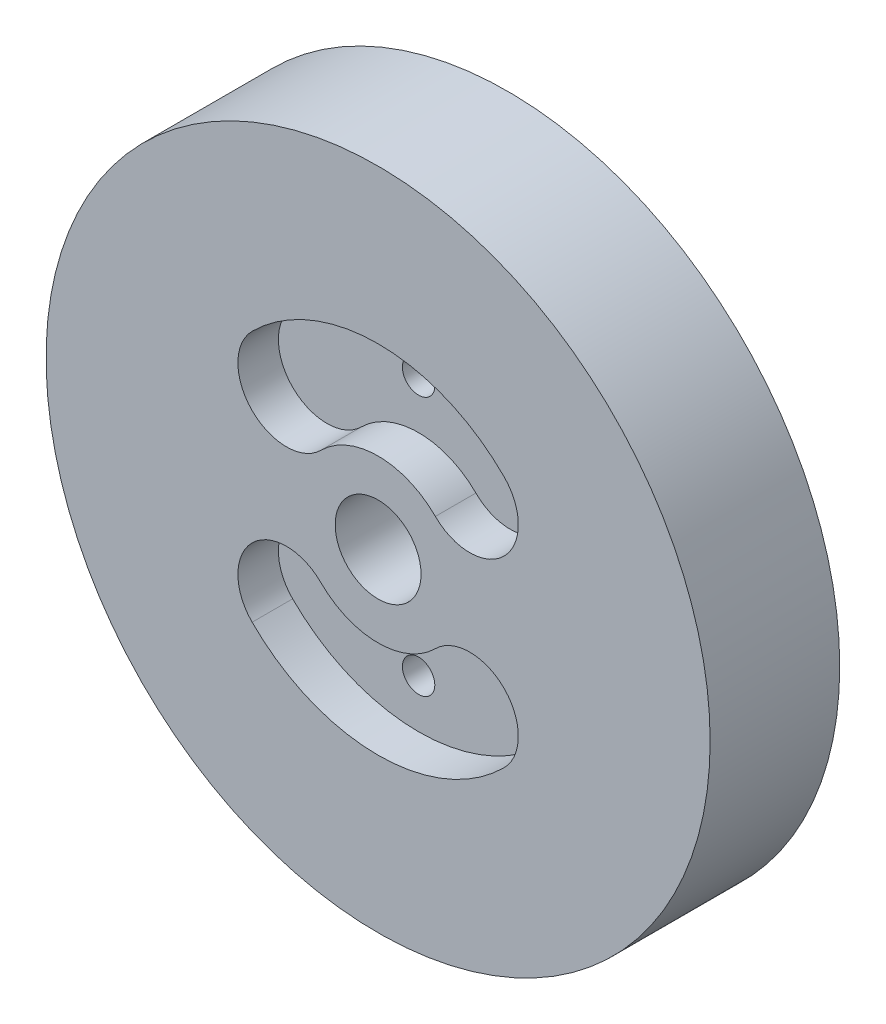
ISO-10303-21;
HEADER;
FILE_DESCRIPTION(('STEP AP214'),'2;1');
FILE_NAME('part.step','',(''),(''),'','','');
FILE_SCHEMA(('AUTOMOTIVE_DESIGN { 1 0 10303 214 1 1 1 1 }'));
ENDSEC;
DATA;
#1=APPLICATION_CONTEXT('core data for automotive mechanical design processes');
#2=APPLICATION_PROTOCOL_DEFINITION('international standard','automotive_design',2000,#1);
#3=PRODUCT_CONTEXT('',#1,'mechanical');
#4=PRODUCT('Part','Part','',(#3));
#5=PRODUCT_RELATED_PRODUCT_CATEGORY('part','',(#4));
#6=PRODUCT_DEFINITION_FORMATION('','',#4);
#7=PRODUCT_DEFINITION_CONTEXT('part definition',#1,'design');
#8=PRODUCT_DEFINITION('design','',#6,#7);
#9=PRODUCT_DEFINITION_SHAPE('','',#8);
#10=(LENGTH_UNIT() NAMED_UNIT(*) SI_UNIT(.MILLI.,.METRE.));
#11=(NAMED_UNIT(*) PLANE_ANGLE_UNIT() SI_UNIT($,.RADIAN.));
#12=(NAMED_UNIT(*) SI_UNIT($,.STERADIAN.) SOLID_ANGLE_UNIT());
#13=UNCERTAINTY_MEASURE_WITH_UNIT(LENGTH_MEASURE(1.E-05),#10,'distance_accuracy_value','');
#14=(GEOMETRIC_REPRESENTATION_CONTEXT(3) GLOBAL_UNCERTAINTY_ASSIGNED_CONTEXT((#13)) GLOBAL_UNIT_ASSIGNED_CONTEXT((#10,
#11,#12)) REPRESENTATION_CONTEXT('',''));
#15=CARTESIAN_POINT('',(0.,0.,0.));
#16=DIRECTION('',(0.,0.,1.));
#17=DIRECTION('',(1.,0.,0.));
#18=AXIS2_PLACEMENT_3D('',#15,#16,#17);
#19=CARTESIAN_POINT('',(0.,0.,0.));
#20=DIRECTION('',(0.,0.,1.));
#21=DIRECTION('',(1.,0.,0.));
#22=AXIS2_PLACEMENT_3D('',#19,#20,#21);
#23=PLANE('',#22);
#24=CARTESIAN_POINT('',(12.5,0.,0.));
#25=DIRECTION('',(0.,0.,-1.));
#26=DIRECTION('',(-1.,0.,0.));
#27=AXIS2_PLACEMENT_3D('',#24,#25,#26);
#28=CIRCLE('',#27,2.65);
#29=CARTESIAN_POINT('',(9.85,0.,0.));
#30=VERTEX_POINT('',#29);
#31=EDGE_CURVE('E244',#30,#30,#28,.T.);
#32=ORIENTED_EDGE('',*,*,#31,.F.);
#33=EDGE_LOOP('',(#32));
#34=FACE_BOUND('',#33,.T.);
#35=CARTESIAN_POINT('',(-12.5,0.,0.));
#36=DIRECTION('',(0.,0.,-1.));
#37=DIRECTION('',(-1.,0.,0.));
#38=AXIS2_PLACEMENT_3D('',#35,#36,#37);
#39=CIRCLE('',#38,2.65);
#40=CARTESIAN_POINT('',(-15.15,0.,0.));
#41=VERTEX_POINT('',#40);
#42=EDGE_CURVE('E240',#41,#41,#39,.T.);
#43=ORIENTED_EDGE('',*,*,#42,.F.);
#44=EDGE_LOOP('',(#43));
#45=FACE_BOUND('',#44,.T.);
#46=CARTESIAN_POINT('',(0.,0.,0.));
#47=DIRECTION('',(0.,0.,1.));
#48=DIRECTION('',(1.,0.,0.));
#49=AXIS2_PLACEMENT_3D('',#46,#47,#48);
#50=CIRCLE('',#49,20.5);
#51=CARTESIAN_POINT('',(20.5,0.,0.));
#52=VERTEX_POINT('',#51);
#53=EDGE_CURVE('E47',#52,#52,#50,.T.);
#54=ORIENTED_EDGE('',*,*,#53,.F.);
#55=EDGE_LOOP('',(#54));
#56=FACE_BOUND('',#55,.T.);
#57=CARTESIAN_POINT('',(0.,0.,0.));
#58=DIRECTION('',(0.,0.,1.));
#59=DIRECTION('',(1.,0.,0.));
#60=AXIS2_PLACEMENT_3D('',#57,#58,#59);
#61=CIRCLE('',#60,2.65);
#62=CARTESIAN_POINT('',(2.65,0.,0.));
#63=VERTEX_POINT('',#62);
#64=EDGE_CURVE('E41',#63,#63,#61,.F.);
#65=ORIENTED_EDGE('',*,*,#64,.F.);
#66=EDGE_LOOP('',(#65));
#67=FACE_BOUND('',#66,.T.);
#68=CARTESIAN_POINT('',(0.,-8.,0.));
#69=DIRECTION('',(0.,0.,1.));
#70=DIRECTION('',(1.,0.,0.));
#71=AXIS2_PLACEMENT_3D('',#68,#69,#70);
#72=CIRCLE('',#71,1.);
#73=CARTESIAN_POINT('',(1.,-8.,0.));
#74=VERTEX_POINT('',#73);
#75=EDGE_CURVE('E221',#74,#74,#72,.F.);
#76=ORIENTED_EDGE('',*,*,#75,.F.);
#77=EDGE_LOOP('',(#76));
#78=FACE_BOUND('',#77,.T.);
#79=CARTESIAN_POINT('',(0.,8.,0.));
#80=DIRECTION('',(0.,0.,1.));
#81=DIRECTION('',(1.,0.,0.));
#82=AXIS2_PLACEMENT_3D('',#79,#80,#81);
#83=CIRCLE('',#82,1.);
#84=CARTESIAN_POINT('',(1.,8.,0.));
#85=VERTEX_POINT('',#84);
#86=EDGE_CURVE('E224',#85,#85,#83,.T.);
#87=ORIENTED_EDGE('',*,*,#86,.T.);
#88=EDGE_LOOP('',(#87));
#89=FACE_BOUND('',#88,.T.);
#90=ADVANCED_FACE('F37',(#34,#45,#56,#67,#78,#89),#23,.F.);
#91=CARTESIAN_POINT('',(0.,0.,8.));
#92=DIRECTION('',(0.,0.,1.));
#93=DIRECTION('',(1.,0.,0.));
#94=AXIS2_PLACEMENT_3D('',#91,#92,#93);
#95=PLANE('',#94);
#96=CARTESIAN_POINT('',(0.,0.,8.));
#97=DIRECTION('',(0.,0.,1.));
#98=DIRECTION('',(1.,0.,0.));
#99=AXIS2_PLACEMENT_3D('',#96,#97,#98);
#100=CIRCLE('',#99,20.5);
#101=CARTESIAN_POINT('',(20.5,0.,8.));
#102=VERTEX_POINT('',#101);
#103=EDGE_CURVE('E11',#102,#102,#100,.T.);
#104=ORIENTED_EDGE('',*,*,#103,.T.);
#105=EDGE_LOOP('',(#104));
#106=FACE_BOUND('',#105,.T.);
#107=CARTESIAN_POINT('',(0.,0.,8.));
#108=DIRECTION('',(0.,0.,1.));
#109=DIRECTION('',(1.,0.,0.));
#110=AXIS2_PLACEMENT_3D('',#107,#108,#109);
#111=CIRCLE('',#110,2.65);
#112=CARTESIAN_POINT('',(2.65,0.,8.));
#113=VERTEX_POINT('',#112);
#114=EDGE_CURVE('E156',#113,#113,#111,.T.);
#115=ORIENTED_EDGE('',*,*,#114,.F.);
#116=EDGE_LOOP('',(#115));
#117=FACE_BOUND('',#116,.T.);
#118=CARTESIAN_POINT('',(0.,0.,8.));
#119=DIRECTION('',(0.,0.,1.));
#120=DIRECTION('',(1.,0.,0.));
#121=AXIS2_PLACEMENT_3D('',#118,#119,#120);
#122=CIRCLE('',#121,11.);
#123=CARTESIAN_POINT('',(7.77817459305204,-7.77817459305201,8.));
#124=VERTEX_POINT('',#123);
#125=CARTESIAN_POINT('',(-7.77817459305203,-7.77817459305201,8.));
#126=VERTEX_POINT('',#125);
#127=EDGE_CURVE('E179',#124,#126,#122,.F.);
#128=ORIENTED_EDGE('',*,*,#127,.T.);
#129=CARTESIAN_POINT('',(-5.65685424949239,-5.65685424949237,8.));
#130=DIRECTION('',(0.,0.,1.));
#131=DIRECTION('',(1.,0.,0.));
#132=AXIS2_PLACEMENT_3D('',#129,#130,#131);
#133=CIRCLE('',#132,3.);
#134=CARTESIAN_POINT('',(-3.53553390593274,-3.53553390593273,8.));
#135=VERTEX_POINT('',#134);
#136=EDGE_CURVE('E63',#126,#135,#133,.F.);
#137=ORIENTED_EDGE('',*,*,#136,.T.);
#138=CARTESIAN_POINT('',(0.,0.,8.));
#139=DIRECTION('',(0.,0.,1.));
#140=DIRECTION('',(1.,0.,0.));
#141=AXIS2_PLACEMENT_3D('',#138,#139,#140);
#142=CIRCLE('',#141,5.);
#143=CARTESIAN_POINT('',(3.53553390593274,-3.53553390593273,8.));
#144=VERTEX_POINT('',#143);
#145=EDGE_CURVE('E166',#144,#135,#142,.F.);
#146=ORIENTED_EDGE('',*,*,#145,.F.);
#147=CARTESIAN_POINT('',(5.65685424949239,-5.65685424949237,8.));
#148=DIRECTION('',(0.,0.,1.));
#149=DIRECTION('',(1.,0.,0.));
#150=AXIS2_PLACEMENT_3D('',#147,#148,#149);
#151=CIRCLE('',#150,3.);
#152=EDGE_CURVE('E183',#144,#124,#151,.F.);
#153=ORIENTED_EDGE('',*,*,#152,.T.);
#154=EDGE_LOOP('',(#128,#137,#146,#153));
#155=FACE_BOUND('',#154,.T.);
#156=CARTESIAN_POINT('',(0.,0.,8.));
#157=DIRECTION('',(0.,0.,1.));
#158=DIRECTION('',(1.,0.,0.));
#159=AXIS2_PLACEMENT_3D('',#156,#157,#158);
#160=CIRCLE('',#159,11.);
#161=CARTESIAN_POINT('',(7.77817459305204,7.77817459305201,8.));
#162=VERTEX_POINT('',#161);
#163=CARTESIAN_POINT('',(-7.77817459305204,7.77817459305201,8.));
#164=VERTEX_POINT('',#163);
#165=EDGE_CURVE('E55',#162,#164,#160,.T.);
#166=ORIENTED_EDGE('',*,*,#165,.F.);
#167=CARTESIAN_POINT('',(5.65685424949239,5.65685424949237,8.));
#168=DIRECTION('',(0.,0.,1.));
#169=DIRECTION('',(1.,0.,0.));
#170=AXIS2_PLACEMENT_3D('',#167,#168,#169);
#171=CIRCLE('',#170,3.);
#172=CARTESIAN_POINT('',(3.53553390593274,3.53553390593273,8.));
#173=VERTEX_POINT('',#172);
#174=EDGE_CURVE('E129',#173,#162,#171,.T.);
#175=ORIENTED_EDGE('',*,*,#174,.F.);
#176=CARTESIAN_POINT('',(0.,0.,8.));
#177=DIRECTION('',(0.,0.,1.));
#178=DIRECTION('',(1.,0.,0.));
#179=AXIS2_PLACEMENT_3D('',#176,#177,#178);
#180=CIRCLE('',#179,5.);
#181=CARTESIAN_POINT('',(-3.53553390593274,3.53553390593273,8.));
#182=VERTEX_POINT('',#181);
#183=EDGE_CURVE('E134',#173,#182,#180,.T.);
#184=ORIENTED_EDGE('',*,*,#183,.T.);
#185=CARTESIAN_POINT('',(-5.65685424949239,5.65685424949237,8.));
#186=DIRECTION('',(0.,0.,1.));
#187=DIRECTION('',(1.,0.,0.));
#188=AXIS2_PLACEMENT_3D('',#185,#186,#187);
#189=CIRCLE('',#188,3.);
#190=EDGE_CURVE('E146',#164,#182,#189,.T.);
#191=ORIENTED_EDGE('',*,*,#190,.F.);
#192=EDGE_LOOP('',(#166,#175,#184,#191));
#193=FACE_BOUND('',#192,.T.);
#194=ADVANCED_FACE('F216',(#106,#117,#155,#193),#95,.T.);
#195=CARTESIAN_POINT('',(0.,0.,8.));
#196=DIRECTION('',(0.,0.,-1.));
#197=DIRECTION('',(-1.,0.,0.));
#198=AXIS2_PLACEMENT_3D('',#195,#196,#197);
#199=CYLINDRICAL_SURFACE('',#198,20.5);
#200=ORIENTED_EDGE('',*,*,#103,.F.);
#201=EDGE_LOOP('',(#200));
#202=FACE_BOUND('',#201,.T.);
#203=ORIENTED_EDGE('',*,*,#53,.T.);
#204=EDGE_LOOP('',(#203));
#205=FACE_BOUND('',#204,.T.);
#206=ADVANCED_FACE('F39',(#202,#205),#199,.T.);
#207=CARTESIAN_POINT('',(0.,0.,8.));
#208=DIRECTION('',(0.,0.,-1.));
#209=DIRECTION('',(-1.,0.,0.));
#210=AXIS2_PLACEMENT_3D('',#207,#208,#209);
#211=CYLINDRICAL_SURFACE('',#210,2.65);
#212=ORIENTED_EDGE('',*,*,#114,.T.);
#213=EDGE_LOOP('',(#212));
#214=FACE_BOUND('',#213,.T.);
#215=ORIENTED_EDGE('',*,*,#64,.T.);
#216=EDGE_LOOP('',(#215));
#217=FACE_BOUND('',#216,.T.);
#218=ADVANCED_FACE('F212',(#214,#217),#211,.F.);
#219=CARTESIAN_POINT('',(-5.65685424949239,-5.65685424949237,5.5));
#220=DIRECTION('',(0.,0.,1.));
#221=DIRECTION('',(1.,0.,0.));
#222=AXIS2_PLACEMENT_3D('',#219,#220,#221);
#223=CYLINDRICAL_SURFACE('',#222,3.);
#224=ORIENTED_EDGE('',*,*,#136,.F.);
#225=DIRECTION('',(0.,0.,1.));
#226=VECTOR('',#225,1.);
#227=CARTESIAN_POINT('',(-7.77817459305203,-7.77817459305201,5.5));
#228=LINE('',#227,#226);
#229=CARTESIAN_POINT('',(-7.77817459305203,-7.77817459305201,5.5));
#230=VERTEX_POINT('',#229);
#231=EDGE_CURVE('E176',#230,#126,#228,.T.);
#232=ORIENTED_EDGE('',*,*,#231,.F.);
#233=CARTESIAN_POINT('',(-5.65685424949239,-5.65685424949237,5.5));
#234=DIRECTION('',(0.,0.,1.));
#235=DIRECTION('',(1.,0.,0.));
#236=AXIS2_PLACEMENT_3D('',#233,#234,#235);
#237=CIRCLE('',#236,3.);
#238=CARTESIAN_POINT('',(-3.53553390593274,-3.53553390593273,5.5));
#239=VERTEX_POINT('',#238);
#240=EDGE_CURVE('E162',#230,#239,#237,.F.);
#241=ORIENTED_EDGE('',*,*,#240,.T.);
#242=DIRECTION('',(0.,0.,1.));
#243=VECTOR('',#242,1.);
#244=CARTESIAN_POINT('',(-3.53553390593274,-3.53553390593273,5.5));
#245=LINE('',#244,#243);
#246=EDGE_CURVE('E147',#239,#135,#245,.T.);
#247=ORIENTED_EDGE('',*,*,#246,.T.);
#248=EDGE_LOOP('',(#224,#232,#241,#247));
#249=FACE_BOUND('',#248,.T.);
#250=ADVANCED_FACE('F309',(#249),#223,.F.);
#251=CARTESIAN_POINT('',(0.,0.,5.5));
#252=DIRECTION('',(0.,0.,1.));
#253=DIRECTION('',(1.,0.,0.));
#254=AXIS2_PLACEMENT_3D('',#251,#252,#253);
#255=CYLINDRICAL_SURFACE('',#254,5.);
#256=ORIENTED_EDGE('',*,*,#145,.T.);
#257=ORIENTED_EDGE('',*,*,#246,.F.);
#258=CARTESIAN_POINT('',(0.,0.,5.5));
#259=DIRECTION('',(0.,0.,1.));
#260=DIRECTION('',(1.,0.,0.));
#261=AXIS2_PLACEMENT_3D('',#258,#259,#260);
#262=CIRCLE('',#261,5.);
#263=CARTESIAN_POINT('',(3.53553390593274,-3.53553390593273,5.5));
#264=VERTEX_POINT('',#263);
#265=EDGE_CURVE('E172',#264,#239,#262,.F.);
#266=ORIENTED_EDGE('',*,*,#265,.F.);
#267=DIRECTION('',(0.,0.,1.));
#268=VECTOR('',#267,1.);
#269=CARTESIAN_POINT('',(3.53553390593274,-3.53553390593273,5.5));
#270=LINE('',#269,#268);
#271=EDGE_CURVE('E192',#264,#144,#270,.T.);
#272=ORIENTED_EDGE('',*,*,#271,.T.);
#273=EDGE_LOOP('',(#256,#257,#266,#272));
#274=FACE_BOUND('',#273,.T.);
#275=ADVANCED_FACE('F305',(#274),#255,.T.);
#276=CARTESIAN_POINT('',(5.65685424949239,-5.65685424949237,5.5));
#277=DIRECTION('',(0.,0.,1.));
#278=DIRECTION('',(1.,0.,0.));
#279=AXIS2_PLACEMENT_3D('',#276,#277,#278);
#280=CYLINDRICAL_SURFACE('',#279,3.);
#281=ORIENTED_EDGE('',*,*,#152,.F.);
#282=ORIENTED_EDGE('',*,*,#271,.F.);
#283=CARTESIAN_POINT('',(5.65685424949239,-5.65685424949237,5.5));
#284=DIRECTION('',(0.,0.,1.));
#285=DIRECTION('',(1.,0.,0.));
#286=AXIS2_PLACEMENT_3D('',#283,#284,#285);
#287=CIRCLE('',#286,3.);
#288=CARTESIAN_POINT('',(7.77817459305204,-7.77817459305201,5.5));
#289=VERTEX_POINT('',#288);
#290=EDGE_CURVE('E169',#264,#289,#287,.F.);
#291=ORIENTED_EDGE('',*,*,#290,.T.);
#292=DIRECTION('',(0.,0.,1.));
#293=VECTOR('',#292,1.);
#294=CARTESIAN_POINT('',(7.77817459305204,-7.77817459305201,5.5));
#295=LINE('',#294,#293);
#296=EDGE_CURVE('E195',#289,#124,#295,.T.);
#297=ORIENTED_EDGE('',*,*,#296,.T.);
#298=EDGE_LOOP('',(#281,#282,#291,#297));
#299=FACE_BOUND('',#298,.T.);
#300=ADVANCED_FACE('F308',(#299),#280,.F.);
#301=CARTESIAN_POINT('',(0.,0.,5.5));
#302=DIRECTION('',(0.,0.,1.));
#303=DIRECTION('',(1.,0.,0.));
#304=AXIS2_PLACEMENT_3D('',#301,#302,#303);
#305=CYLINDRICAL_SURFACE('',#304,11.);
#306=ORIENTED_EDGE('',*,*,#127,.F.);
#307=ORIENTED_EDGE('',*,*,#296,.F.);
#308=CARTESIAN_POINT('',(0.,0.,5.5));
#309=DIRECTION('',(0.,0.,1.));
#310=DIRECTION('',(1.,0.,0.));
#311=AXIS2_PLACEMENT_3D('',#308,#309,#310);
#312=CIRCLE('',#311,11.);
#313=EDGE_CURVE('E165',#289,#230,#312,.F.);
#314=ORIENTED_EDGE('',*,*,#313,.T.);
#315=ORIENTED_EDGE('',*,*,#231,.T.);
#316=EDGE_LOOP('',(#306,#307,#314,#315));
#317=FACE_BOUND('',#316,.T.);
#318=ADVANCED_FACE('F303',(#317),#305,.F.);
#319=CARTESIAN_POINT('',(0.,0.,5.5));
#320=DIRECTION('',(0.,0.,1.));
#321=DIRECTION('',(1.,0.,0.));
#322=AXIS2_PLACEMENT_3D('',#319,#320,#321);
#323=PLANE('',#322);
#324=ORIENTED_EDGE('',*,*,#240,.F.);
#325=ORIENTED_EDGE('',*,*,#313,.F.);
#326=ORIENTED_EDGE('',*,*,#290,.F.);
#327=ORIENTED_EDGE('',*,*,#265,.T.);
#328=EDGE_LOOP('',(#324,#325,#326,#327));
#329=FACE_BOUND('',#328,.T.);
#330=CARTESIAN_POINT('',(0.,-8.,5.5));
#331=DIRECTION('',(0.,0.,1.));
#332=DIRECTION('',(1.,0.,0.));
#333=AXIS2_PLACEMENT_3D('',#330,#331,#332);
#334=CIRCLE('',#333,1.);
#335=CARTESIAN_POINT('',(1.,-8.,5.5));
#336=VERTEX_POINT('',#335);
#337=EDGE_CURVE('E227',#336,#336,#334,.F.);
#338=ORIENTED_EDGE('',*,*,#337,.T.);
#339=EDGE_LOOP('',(#338));
#340=FACE_BOUND('',#339,.T.);
#341=ADVANCED_FACE('F300',(#329,#340),#323,.T.);
#342=CARTESIAN_POINT('',(0.,0.,5.5));
#343=DIRECTION('',(0.,0.,1.));
#344=DIRECTION('',(1.,0.,0.));
#345=AXIS2_PLACEMENT_3D('',#342,#343,#344);
#346=CYLINDRICAL_SURFACE('',#345,11.);
#347=ORIENTED_EDGE('',*,*,#165,.T.);
#348=DIRECTION('',(0.,0.,1.));
#349=VECTOR('',#348,1.);
#350=CARTESIAN_POINT('',(-7.77817459305204,7.77817459305201,5.5));
#351=LINE('',#350,#349);
#352=CARTESIAN_POINT('',(-7.77817459305204,7.77817459305201,5.5));
#353=VERTEX_POINT('',#352);
#354=EDGE_CURVE('E104',#353,#164,#351,.T.);
#355=ORIENTED_EDGE('',*,*,#354,.F.);
#356=CARTESIAN_POINT('',(0.,0.,5.5));
#357=DIRECTION('',(0.,0.,1.));
#358=DIRECTION('',(1.,0.,0.));
#359=AXIS2_PLACEMENT_3D('',#356,#357,#358);
#360=CIRCLE('',#359,11.);
#361=CARTESIAN_POINT('',(7.77817459305204,7.77817459305201,5.5));
#362=VERTEX_POINT('',#361);
#363=EDGE_CURVE('E108',#362,#353,#360,.T.);
#364=ORIENTED_EDGE('',*,*,#363,.F.);
#365=DIRECTION('',(0.,0.,1.));
#366=VECTOR('',#365,1.);
#367=CARTESIAN_POINT('',(7.77817459305204,7.77817459305201,5.5));
#368=LINE('',#367,#366);
#369=EDGE_CURVE('E153',#362,#162,#368,.T.);
#370=ORIENTED_EDGE('',*,*,#369,.T.);
#371=EDGE_LOOP('',(#347,#355,#364,#370));
#372=FACE_BOUND('',#371,.T.);
#373=ADVANCED_FACE('F106',(#372),#346,.F.);
#374=CARTESIAN_POINT('',(5.65685424949239,5.65685424949237,5.5));
#375=DIRECTION('',(0.,0.,1.));
#376=DIRECTION('',(1.,0.,0.));
#377=AXIS2_PLACEMENT_3D('',#374,#375,#376);
#378=CYLINDRICAL_SURFACE('',#377,3.);
#379=ORIENTED_EDGE('',*,*,#174,.T.);
#380=ORIENTED_EDGE('',*,*,#369,.F.);
#381=CARTESIAN_POINT('',(5.65685424949239,5.65685424949237,5.5));
#382=DIRECTION('',(0.,0.,1.));
#383=DIRECTION('',(1.,0.,0.));
#384=AXIS2_PLACEMENT_3D('',#381,#382,#383);
#385=CIRCLE('',#384,3.);
#386=CARTESIAN_POINT('',(3.53553390593274,3.53553390593273,5.5));
#387=VERTEX_POINT('',#386);
#388=EDGE_CURVE('E115',#387,#362,#385,.T.);
#389=ORIENTED_EDGE('',*,*,#388,.F.);
#390=DIRECTION('',(0.,0.,1.));
#391=VECTOR('',#390,1.);
#392=CARTESIAN_POINT('',(3.53553390593274,3.53553390593273,5.5));
#393=LINE('',#392,#391);
#394=EDGE_CURVE('E157',#387,#173,#393,.T.);
#395=ORIENTED_EDGE('',*,*,#394,.T.);
#396=EDGE_LOOP('',(#379,#380,#389,#395));
#397=FACE_BOUND('',#396,.T.);
#398=ADVANCED_FACE('F288',(#397),#378,.F.);
#399=CARTESIAN_POINT('',(0.,0.,5.5));
#400=DIRECTION('',(0.,0.,1.));
#401=DIRECTION('',(1.,0.,0.));
#402=AXIS2_PLACEMENT_3D('',#399,#400,#401);
#403=CYLINDRICAL_SURFACE('',#402,5.);
#404=ORIENTED_EDGE('',*,*,#183,.F.);
#405=ORIENTED_EDGE('',*,*,#394,.F.);
#406=CARTESIAN_POINT('',(0.,0.,5.5));
#407=DIRECTION('',(0.,0.,1.));
#408=DIRECTION('',(1.,0.,0.));
#409=AXIS2_PLACEMENT_3D('',#406,#407,#408);
#410=CIRCLE('',#409,5.);
#411=CARTESIAN_POINT('',(-3.53553390593274,3.53553390593273,5.5));
#412=VERTEX_POINT('',#411);
#413=EDGE_CURVE('E124',#387,#412,#410,.T.);
#414=ORIENTED_EDGE('',*,*,#413,.T.);
#415=DIRECTION('',(0.,0.,1.));
#416=VECTOR('',#415,1.);
#417=CARTESIAN_POINT('',(-3.53553390593274,3.53553390593273,5.5));
#418=LINE('',#417,#416);
#419=EDGE_CURVE('E114',#412,#182,#418,.T.);
#420=ORIENTED_EDGE('',*,*,#419,.T.);
#421=EDGE_LOOP('',(#404,#405,#414,#420));
#422=FACE_BOUND('',#421,.T.);
#423=ADVANCED_FACE('F291',(#422),#403,.T.);
#424=CARTESIAN_POINT('',(-5.65685424949239,5.65685424949237,5.5));
#425=DIRECTION('',(0.,0.,1.));
#426=DIRECTION('',(1.,0.,0.));
#427=AXIS2_PLACEMENT_3D('',#424,#425,#426);
#428=CYLINDRICAL_SURFACE('',#427,3.);
#429=ORIENTED_EDGE('',*,*,#190,.T.);
#430=ORIENTED_EDGE('',*,*,#419,.F.);
#431=CARTESIAN_POINT('',(-5.65685424949239,5.65685424949237,5.5));
#432=DIRECTION('',(0.,0.,1.));
#433=DIRECTION('',(1.,0.,0.));
#434=AXIS2_PLACEMENT_3D('',#431,#432,#433);
#435=CIRCLE('',#434,3.);
#436=EDGE_CURVE('E119',#353,#412,#435,.T.);
#437=ORIENTED_EDGE('',*,*,#436,.F.);
#438=ORIENTED_EDGE('',*,*,#354,.T.);
#439=EDGE_LOOP('',(#429,#430,#437,#438));
#440=FACE_BOUND('',#439,.T.);
#441=ADVANCED_FACE('F120',(#440),#428,.F.);
#442=CARTESIAN_POINT('',(0.,0.,5.5));
#443=DIRECTION('',(0.,0.,1.));
#444=DIRECTION('',(1.,0.,0.));
#445=AXIS2_PLACEMENT_3D('',#442,#443,#444);
#446=PLANE('',#445);
#447=CARTESIAN_POINT('',(0.,8.,5.5));
#448=DIRECTION('',(0.,0.,1.));
#449=DIRECTION('',(1.,0.,0.));
#450=AXIS2_PLACEMENT_3D('',#447,#448,#449);
#451=CIRCLE('',#450,1.);
#452=CARTESIAN_POINT('',(1.,8.,5.5));
#453=VERTEX_POINT('',#452);
#454=EDGE_CURVE('E137',#453,#453,#451,.T.);
#455=ORIENTED_EDGE('',*,*,#454,.F.);
#456=EDGE_LOOP('',(#455));
#457=FACE_BOUND('',#456,.T.);
#458=ORIENTED_EDGE('',*,*,#363,.T.);
#459=ORIENTED_EDGE('',*,*,#436,.T.);
#460=ORIENTED_EDGE('',*,*,#413,.F.);
#461=ORIENTED_EDGE('',*,*,#388,.T.);
#462=EDGE_LOOP('',(#458,#459,#460,#461));
#463=FACE_BOUND('',#462,.T.);
#464=ADVANCED_FACE('F126',(#457,#463),#446,.T.);
#465=CARTESIAN_POINT('',(0.,8.,0.));
#466=DIRECTION('',(0.,0.,1.));
#467=DIRECTION('',(1.,0.,0.));
#468=AXIS2_PLACEMENT_3D('',#465,#466,#467);
#469=CYLINDRICAL_SURFACE('',#468,1.);
#470=ORIENTED_EDGE('',*,*,#454,.T.);
#471=EDGE_LOOP('',(#470));
#472=FACE_BOUND('',#471,.T.);
#473=ORIENTED_EDGE('',*,*,#86,.F.);
#474=EDGE_LOOP('',(#473));
#475=FACE_BOUND('',#474,.T.);
#476=ADVANCED_FACE('F276',(#472,#475),#469,.F.);
#477=CARTESIAN_POINT('',(0.,-8.,0.));
#478=DIRECTION('',(0.,0.,1.));
#479=DIRECTION('',(1.,0.,0.));
#480=AXIS2_PLACEMENT_3D('',#477,#478,#479);
#481=CYLINDRICAL_SURFACE('',#480,1.);
#482=ORIENTED_EDGE('',*,*,#337,.F.);
#483=EDGE_LOOP('',(#482));
#484=FACE_BOUND('',#483,.T.);
#485=ORIENTED_EDGE('',*,*,#75,.T.);
#486=EDGE_LOOP('',(#485));
#487=FACE_BOUND('',#486,.T.);
#488=ADVANCED_FACE('F267',(#484,#487),#481,.F.);
#489=CARTESIAN_POINT('',(-12.5,0.,5.));
#490=DIRECTION('',(0.,0.,-1.));
#491=DIRECTION('',(-1.,0.,0.));
#492=AXIS2_PLACEMENT_3D('',#489,#490,#491);
#493=CYLINDRICAL_SURFACE('',#492,2.65);
#494=CARTESIAN_POINT('',(-12.5,0.,5.));
#495=DIRECTION('',(0.,0.,-1.));
#496=DIRECTION('',(-1.,0.,0.));
#497=AXIS2_PLACEMENT_3D('',#494,#495,#496);
#498=CIRCLE('',#497,2.65);
#499=CARTESIAN_POINT('',(-15.15,0.,5.));
#500=VERTEX_POINT('',#499);
#501=EDGE_CURVE('E236',#500,#500,#498,.T.);
#502=ORIENTED_EDGE('',*,*,#501,.F.);
#503=EDGE_LOOP('',(#502));
#504=FACE_BOUND('',#503,.T.);
#505=ORIENTED_EDGE('',*,*,#42,.T.);
#506=EDGE_LOOP('',(#505));
#507=FACE_BOUND('',#506,.T.);
#508=ADVANCED_FACE('F265',(#504,#507),#493,.F.);
#509=CARTESIAN_POINT('',(-12.5,0.,5.));
#510=DIRECTION('',(0.,0.,-1.));
#511=DIRECTION('',(-1.,0.,0.));
#512=AXIS2_PLACEMENT_3D('',#509,#510,#511);
#513=PLANE('',#512);
#514=ORIENTED_EDGE('',*,*,#501,.T.);
#515=EDGE_LOOP('',(#514));
#516=FACE_BOUND('',#515,.T.);
#517=ADVANCED_FACE('F258',(#516),#513,.T.);
#518=CARTESIAN_POINT('',(12.5,0.,5.));
#519=DIRECTION('',(0.,0.,-1.));
#520=DIRECTION('',(-1.,0.,0.));
#521=AXIS2_PLACEMENT_3D('',#518,#519,#520);
#522=CYLINDRICAL_SURFACE('',#521,2.65);
#523=CARTESIAN_POINT('',(12.5,0.,5.));
#524=DIRECTION('',(0.,0.,-1.));
#525=DIRECTION('',(-1.,0.,0.));
#526=AXIS2_PLACEMENT_3D('',#523,#524,#525);
#527=CIRCLE('',#526,2.65);
#528=CARTESIAN_POINT('',(9.85,0.,5.));
#529=VERTEX_POINT('',#528);
#530=EDGE_CURVE('E233',#529,#529,#527,.T.);
#531=ORIENTED_EDGE('',*,*,#530,.F.);
#532=EDGE_LOOP('',(#531));
#533=FACE_BOUND('',#532,.T.);
#534=ORIENTED_EDGE('',*,*,#31,.T.);
#535=EDGE_LOOP('',(#534));
#536=FACE_BOUND('',#535,.T.);
#537=ADVANCED_FACE('F255',(#533,#536),#522,.F.);
#538=CARTESIAN_POINT('',(12.5,0.,5.));
#539=DIRECTION('',(0.,0.,-1.));
#540=DIRECTION('',(-1.,0.,0.));
#541=AXIS2_PLACEMENT_3D('',#538,#539,#540);
#542=PLANE('',#541);
#543=ORIENTED_EDGE('',*,*,#530,.T.);
#544=EDGE_LOOP('',(#543));
#545=FACE_BOUND('',#544,.T.);
#546=ADVANCED_FACE('F253',(#545),#542,.T.);
#547=CLOSED_SHELL('',(#90,#194,#206,#218,#250,#275,#300,#318,#341,#373,#398,#423,#441,#464,#476,
#488,#508,#517,#537,#546));
#548=MANIFOLD_SOLID_BREP('B2',#547);
#549=ADVANCED_BREP_SHAPE_REPRESENTATION('',(#18,#548),#14);
#550=SHAPE_DEFINITION_REPRESENTATION(#9,#549);
ENDSEC;
END-ISO-10303-21;
